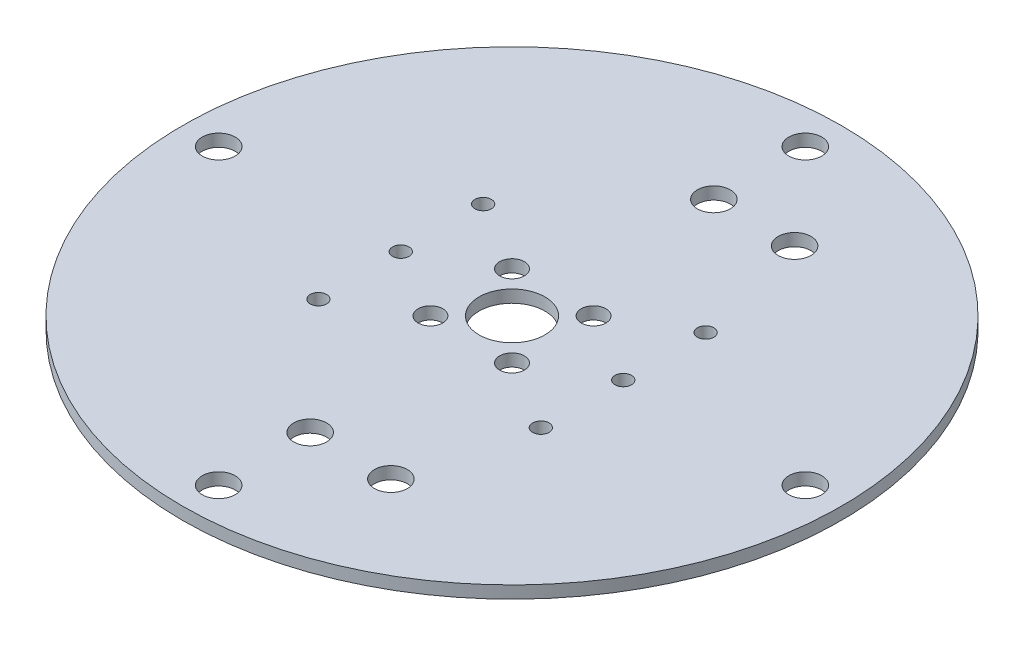
ISO-10303-21;
HEADER;
FILE_DESCRIPTION(('STEP AP214'),'2;1');
FILE_NAME('part.step','',(''),(''),'','','');
FILE_SCHEMA(('AUTOMOTIVE_DESIGN { 1 0 10303 214 1 1 1 1 }'));
ENDSEC;
DATA;
#1=APPLICATION_CONTEXT('core data for automotive mechanical design processes');
#2=APPLICATION_PROTOCOL_DEFINITION('international standard','automotive_design',2000,#1);
#3=PRODUCT_CONTEXT('',#1,'mechanical');
#4=PRODUCT('Part','Part','',(#3));
#5=PRODUCT_RELATED_PRODUCT_CATEGORY('part','',(#4));
#6=PRODUCT_DEFINITION_FORMATION('','',#4);
#7=PRODUCT_DEFINITION_CONTEXT('part definition',#1,'design');
#8=PRODUCT_DEFINITION('design','',#6,#7);
#9=PRODUCT_DEFINITION_SHAPE('','',#8);
#10=(LENGTH_UNIT() NAMED_UNIT(*) SI_UNIT(.MILLI.,.METRE.));
#11=(NAMED_UNIT(*) PLANE_ANGLE_UNIT() SI_UNIT($,.RADIAN.));
#12=(NAMED_UNIT(*) SI_UNIT($,.STERADIAN.) SOLID_ANGLE_UNIT());
#13=UNCERTAINTY_MEASURE_WITH_UNIT(LENGTH_MEASURE(1.E-05),#10,'distance_accuracy_value','');
#14=(GEOMETRIC_REPRESENTATION_CONTEXT(3) GLOBAL_UNCERTAINTY_ASSIGNED_CONTEXT((#13)) GLOBAL_UNIT_ASSIGNED_CONTEXT((#10,
#11,#12)) REPRESENTATION_CONTEXT('',''));
#15=CARTESIAN_POINT('',(0.,0.,0.));
#16=DIRECTION('',(0.,0.,1.));
#17=DIRECTION('',(1.,0.,0.));
#18=AXIS2_PLACEMENT_3D('',#15,#16,#17);
#19=CARTESIAN_POINT('',(0.,1.5,0.));
#20=DIRECTION('',(0.,1.,0.));
#21=DIRECTION('',(0.,0.,1.));
#22=AXIS2_PLACEMENT_3D('',#19,#20,#21);
#23=PLANE('',#22);
#24=CARTESIAN_POINT('',(13.5,1.5,0.));
#25=DIRECTION('',(0.,1.,0.));
#26=DIRECTION('',(0.,0.,-1.));
#27=AXIS2_PLACEMENT_3D('',#24,#25,#26);
#28=CIRCLE('',#27,1.);
#29=CARTESIAN_POINT('',(13.5,1.5,-0.999999999999998));
#30=VERTEX_POINT('',#29);
#31=EDGE_CURVE('E194',#30,#30,#28,.T.);
#32=ORIENTED_EDGE('',*,*,#31,.F.);
#33=EDGE_LOOP('',(#32));
#34=FACE_BOUND('',#33,.T.);
#35=CARTESIAN_POINT('',(-13.5,1.5,10.));
#36=DIRECTION('',(0.,1.,0.));
#37=DIRECTION('',(0.,0.,1.));
#38=AXIS2_PLACEMENT_3D('',#35,#36,#37);
#39=CIRCLE('',#38,1.);
#40=CARTESIAN_POINT('',(-13.5,1.5,11.));
#41=VERTEX_POINT('',#40);
#42=EDGE_CURVE('E178',#41,#41,#39,.T.);
#43=ORIENTED_EDGE('',*,*,#42,.F.);
#44=EDGE_LOOP('',(#43));
#45=FACE_BOUND('',#44,.T.);
#46=CARTESIAN_POINT('',(-13.5,1.5,0.));
#47=DIRECTION('',(0.,1.,0.));
#48=DIRECTION('',(0.,0.,1.));
#49=AXIS2_PLACEMENT_3D('',#46,#47,#48);
#50=CIRCLE('',#49,1.);
#51=CARTESIAN_POINT('',(-13.5,1.5,1.));
#52=VERTEX_POINT('',#51);
#53=EDGE_CURVE('E162',#52,#52,#50,.T.);
#54=ORIENTED_EDGE('',*,*,#53,.F.);
#55=EDGE_LOOP('',(#54));
#56=FACE_BOUND('',#55,.T.);
#57=CARTESIAN_POINT('',(0.,1.5,24.5));
#58=DIRECTION('',(0.,1.,0.));
#59=DIRECTION('',(0.,0.,1.));
#60=AXIS2_PLACEMENT_3D('',#57,#58,#59);
#61=CIRCLE('',#60,2.);
#62=CARTESIAN_POINT('',(0.,1.5,26.5));
#63=VERTEX_POINT('',#62);
#64=EDGE_CURVE('E146',#63,#63,#61,.T.);
#65=ORIENTED_EDGE('',*,*,#64,.F.);
#66=EDGE_LOOP('',(#65));
#67=FACE_BOUND('',#66,.T.);
#68=CARTESIAN_POINT('',(0.,1.5,-24.5));
#69=DIRECTION('',(0.,1.,0.));
#70=DIRECTION('',(0.,0.,1.));
#71=AXIS2_PLACEMENT_3D('',#68,#69,#70);
#72=CIRCLE('',#71,2.);
#73=CARTESIAN_POINT('',(0.,1.5,-22.5));
#74=VERTEX_POINT('',#73);
#75=EDGE_CURVE('E130',#74,#74,#72,.T.);
#76=ORIENTED_EDGE('',*,*,#75,.F.);
#77=EDGE_LOOP('',(#76));
#78=FACE_BOUND('',#77,.T.);
#79=CARTESIAN_POINT('',(4.94974746830589,1.5,4.94974746830577));
#80=DIRECTION('',(0.,1.,0.));
#81=DIRECTION('',(0.,0.,1.));
#82=AXIS2_PLACEMENT_3D('',#79,#80,#81);
#83=CIRCLE('',#82,1.5);
#84=CARTESIAN_POINT('',(4.94974746830589,1.5,6.44974746830577));
#85=VERTEX_POINT('',#84);
#86=EDGE_CURVE('E114',#85,#85,#83,.T.);
#87=ORIENTED_EDGE('',*,*,#86,.F.);
#88=EDGE_LOOP('',(#87));
#89=FACE_BOUND('',#88,.T.);
#90=CARTESIAN_POINT('',(-4.94974746830586,1.5,-4.94974746830581));
#91=DIRECTION('',(0.,1.,0.));
#92=DIRECTION('',(0.,0.,1.));
#93=AXIS2_PLACEMENT_3D('',#90,#91,#92);
#94=CIRCLE('',#93,1.5);
#95=CARTESIAN_POINT('',(-4.94974746830586,1.5,-3.44974746830581));
#96=VERTEX_POINT('',#95);
#97=EDGE_CURVE('E98',#96,#96,#94,.T.);
#98=ORIENTED_EDGE('',*,*,#97,.F.);
#99=EDGE_LOOP('',(#98));
#100=FACE_BOUND('',#99,.T.);
#101=CARTESIAN_POINT('',(35.6,1.5,0.));
#102=DIRECTION('',(0.,1.,0.));
#103=DIRECTION('',(0.,0.,1.));
#104=AXIS2_PLACEMENT_3D('',#101,#102,#103);
#105=CIRCLE('',#104,2.);
#106=CARTESIAN_POINT('',(35.6,1.5,2.));
#107=VERTEX_POINT('',#106);
#108=EDGE_CURVE('E82',#107,#107,#105,.T.);
#109=ORIENTED_EDGE('',*,*,#108,.F.);
#110=EDGE_LOOP('',(#109));
#111=FACE_BOUND('',#110,.T.);
#112=CARTESIAN_POINT('',(-35.6,1.5,0.));
#113=DIRECTION('',(0.,1.,0.));
#114=DIRECTION('',(0.,0.,1.));
#115=AXIS2_PLACEMENT_3D('',#112,#113,#114);
#116=CIRCLE('',#115,2.);
#117=CARTESIAN_POINT('',(-35.6,1.5,2.));
#118=VERTEX_POINT('',#117);
#119=EDGE_CURVE('E66',#118,#118,#116,.T.);
#120=ORIENTED_EDGE('',*,*,#119,.F.);
#121=EDGE_LOOP('',(#120));
#122=FACE_BOUND('',#121,.T.);
#123=CARTESIAN_POINT('',(0.,1.5,0.));
#124=DIRECTION('',(0.,1.,0.));
#125=DIRECTION('',(0.,0.,1.));
#126=AXIS2_PLACEMENT_3D('',#123,#124,#125);
#127=CIRCLE('',#126,40.);
#128=CARTESIAN_POINT('',(0.,1.5,40.));
#129=VERTEX_POINT('',#128);
#130=EDGE_CURVE('E10',#129,#129,#127,.T.);
#131=ORIENTED_EDGE('',*,*,#130,.T.);
#132=EDGE_LOOP('',(#131));
#133=FACE_BOUND('',#132,.T.);
#134=CARTESIAN_POINT('',(0.,1.5,-35.6));
#135=DIRECTION('',(0.,1.,0.));
#136=DIRECTION('',(0.,0.,1.));
#137=AXIS2_PLACEMENT_3D('',#134,#135,#136);
#138=CIRCLE('',#137,2.);
#139=CARTESIAN_POINT('',(0.,1.5,-33.6));
#140=VERTEX_POINT('',#139);
#141=EDGE_CURVE('E60',#140,#140,#138,.T.);
#142=ORIENTED_EDGE('',*,*,#141,.F.);
#143=EDGE_LOOP('',(#142));
#144=FACE_BOUND('',#143,.T.);
#145=CARTESIAN_POINT('',(0.,1.5,35.6));
#146=DIRECTION('',(0.,1.,0.));
#147=DIRECTION('',(0.,0.,1.));
#148=AXIS2_PLACEMENT_3D('',#145,#146,#147);
#149=CIRCLE('',#148,2.);
#150=CARTESIAN_POINT('',(0.,1.5,37.6));
#151=VERTEX_POINT('',#150);
#152=EDGE_CURVE('E74',#151,#151,#149,.T.);
#153=ORIENTED_EDGE('',*,*,#152,.F.);
#154=EDGE_LOOP('',(#153));
#155=FACE_BOUND('',#154,.T.);
#156=CARTESIAN_POINT('',(0.,1.5,0.));
#157=DIRECTION('',(0.,1.,0.));
#158=DIRECTION('',(0.,0.,1.));
#159=AXIS2_PLACEMENT_3D('',#156,#157,#158);
#160=CIRCLE('',#159,4.);
#161=CARTESIAN_POINT('',(0.,1.5,4.));
#162=VERTEX_POINT('',#161);
#163=EDGE_CURVE('E90',#162,#162,#160,.T.);
#164=ORIENTED_EDGE('',*,*,#163,.F.);
#165=EDGE_LOOP('',(#164));
#166=FACE_BOUND('',#165,.T.);
#167=CARTESIAN_POINT('',(4.94974746830582,1.5,-4.94974746830584));
#168=DIRECTION('',(0.,1.,0.));
#169=DIRECTION('',(0.,0.,1.));
#170=AXIS2_PLACEMENT_3D('',#167,#168,#169);
#171=CIRCLE('',#170,1.5);
#172=CARTESIAN_POINT('',(4.94974746830582,1.5,-3.44974746830584));
#173=VERTEX_POINT('',#172);
#174=EDGE_CURVE('E106',#173,#173,#171,.T.);
#175=ORIENTED_EDGE('',*,*,#174,.F.);
#176=EDGE_LOOP('',(#175));
#177=FACE_BOUND('',#176,.T.);
#178=CARTESIAN_POINT('',(-4.94974746830579,1.5,4.94974746830588));
#179=DIRECTION('',(0.,1.,0.));
#180=DIRECTION('',(0.,0.,1.));
#181=AXIS2_PLACEMENT_3D('',#178,#179,#180);
#182=CIRCLE('',#181,1.5);
#183=CARTESIAN_POINT('',(-4.94974746830579,1.5,6.44974746830588));
#184=VERTEX_POINT('',#183);
#185=EDGE_CURVE('E122',#184,#184,#182,.T.);
#186=ORIENTED_EDGE('',*,*,#185,.F.);
#187=EDGE_LOOP('',(#186));
#188=FACE_BOUND('',#187,.T.);
#189=CARTESIAN_POINT('',(9.8,1.5,-24.5));
#190=DIRECTION('',(0.,1.,0.));
#191=DIRECTION('',(0.,0.,1.));
#192=AXIS2_PLACEMENT_3D('',#189,#190,#191);
#193=CIRCLE('',#192,2.);
#194=CARTESIAN_POINT('',(9.8,1.5,-22.5));
#195=VERTEX_POINT('',#194);
#196=EDGE_CURVE('E138',#195,#195,#193,.T.);
#197=ORIENTED_EDGE('',*,*,#196,.F.);
#198=EDGE_LOOP('',(#197));
#199=FACE_BOUND('',#198,.T.);
#200=CARTESIAN_POINT('',(9.8,1.5,24.5));
#201=DIRECTION('',(0.,1.,0.));
#202=DIRECTION('',(0.,0.,-1.));
#203=AXIS2_PLACEMENT_3D('',#200,#201,#202);
#204=CIRCLE('',#203,2.);
#205=CARTESIAN_POINT('',(9.8,1.5,22.5));
#206=VERTEX_POINT('',#205);
#207=EDGE_CURVE('E154',#206,#206,#204,.T.);
#208=ORIENTED_EDGE('',*,*,#207,.F.);
#209=EDGE_LOOP('',(#208));
#210=FACE_BOUND('',#209,.T.);
#211=CARTESIAN_POINT('',(-13.5,1.5,-10.));
#212=DIRECTION('',(0.,1.,0.));
#213=DIRECTION('',(0.,0.,1.));
#214=AXIS2_PLACEMENT_3D('',#211,#212,#213);
#215=CIRCLE('',#214,0.999999999999999);
#216=CARTESIAN_POINT('',(-13.5,1.5,-9.));
#217=VERTEX_POINT('',#216);
#218=EDGE_CURVE('E170',#217,#217,#215,.T.);
#219=ORIENTED_EDGE('',*,*,#218,.F.);
#220=EDGE_LOOP('',(#219));
#221=FACE_BOUND('',#220,.T.);
#222=CARTESIAN_POINT('',(13.5,1.5,-10.));
#223=DIRECTION('',(0.,1.,0.));
#224=DIRECTION('',(0.,0.,-1.));
#225=AXIS2_PLACEMENT_3D('',#222,#223,#224);
#226=CIRCLE('',#225,0.999999999999999);
#227=CARTESIAN_POINT('',(13.5,1.5,-11.));
#228=VERTEX_POINT('',#227);
#229=EDGE_CURVE('E186',#228,#228,#226,.T.);
#230=ORIENTED_EDGE('',*,*,#229,.F.);
#231=EDGE_LOOP('',(#230));
#232=FACE_BOUND('',#231,.T.);
#233=CARTESIAN_POINT('',(13.5,1.5,10.));
#234=DIRECTION('',(0.,1.,0.));
#235=DIRECTION('',(0.,0.,-1.));
#236=AXIS2_PLACEMENT_3D('',#233,#234,#235);
#237=CIRCLE('',#236,1.);
#238=CARTESIAN_POINT('',(13.5,1.5,9.));
#239=VERTEX_POINT('',#238);
#240=EDGE_CURVE('E202',#239,#239,#237,.T.);
#241=ORIENTED_EDGE('',*,*,#240,.F.);
#242=EDGE_LOOP('',(#241));
#243=FACE_BOUND('',#242,.T.);
#244=ADVANCED_FACE('F47',(#34,#45,#56,#67,#78,#89,#100,#111,#122,#133,#144,#155,#166,#177,#188,
#199,#210,#221,#232,#243),#23,.T.);
#245=CARTESIAN_POINT('',(0.,0.,0.));
#246=DIRECTION('',(0.,1.,0.));
#247=DIRECTION('',(0.,0.,1.));
#248=AXIS2_PLACEMENT_3D('',#245,#246,#247);
#249=PLANE('',#248);
#250=CARTESIAN_POINT('',(0.,0.,0.));
#251=DIRECTION('',(0.,1.,0.));
#252=DIRECTION('',(0.,0.,1.));
#253=AXIS2_PLACEMENT_3D('',#250,#251,#252);
#254=CIRCLE('',#253,40.);
#255=CARTESIAN_POINT('',(0.,0.,40.));
#256=VERTEX_POINT('',#255);
#257=EDGE_CURVE('E51',#256,#256,#254,.T.);
#258=ORIENTED_EDGE('',*,*,#257,.F.);
#259=EDGE_LOOP('',(#258));
#260=FACE_BOUND('',#259,.T.);
#261=CARTESIAN_POINT('',(0.,0.,-35.6));
#262=DIRECTION('',(0.,1.,0.));
#263=DIRECTION('',(0.,0.,1.));
#264=AXIS2_PLACEMENT_3D('',#261,#262,#263);
#265=CIRCLE('',#264,2.);
#266=CARTESIAN_POINT('',(0.,0.,-33.6));
#267=VERTEX_POINT('',#266);
#268=EDGE_CURVE('E62',#267,#267,#265,.T.);
#269=ORIENTED_EDGE('',*,*,#268,.T.);
#270=EDGE_LOOP('',(#269));
#271=FACE_BOUND('',#270,.T.);
#272=CARTESIAN_POINT('',(-35.6,0.,0.));
#273=DIRECTION('',(0.,1.,0.));
#274=DIRECTION('',(0.,0.,1.));
#275=AXIS2_PLACEMENT_3D('',#272,#273,#274);
#276=CIRCLE('',#275,2.);
#277=CARTESIAN_POINT('',(-35.6,0.,2.));
#278=VERTEX_POINT('',#277);
#279=EDGE_CURVE('E70',#278,#278,#276,.T.);
#280=ORIENTED_EDGE('',*,*,#279,.T.);
#281=EDGE_LOOP('',(#280));
#282=FACE_BOUND('',#281,.T.);
#283=CARTESIAN_POINT('',(0.,0.,35.6));
#284=DIRECTION('',(0.,1.,0.));
#285=DIRECTION('',(0.,0.,1.));
#286=AXIS2_PLACEMENT_3D('',#283,#284,#285);
#287=CIRCLE('',#286,2.);
#288=CARTESIAN_POINT('',(0.,0.,37.6));
#289=VERTEX_POINT('',#288);
#290=EDGE_CURVE('E78',#289,#289,#287,.T.);
#291=ORIENTED_EDGE('',*,*,#290,.T.);
#292=EDGE_LOOP('',(#291));
#293=FACE_BOUND('',#292,.T.);
#294=CARTESIAN_POINT('',(35.6,0.,0.));
#295=DIRECTION('',(0.,1.,0.));
#296=DIRECTION('',(0.,0.,1.));
#297=AXIS2_PLACEMENT_3D('',#294,#295,#296);
#298=CIRCLE('',#297,2.);
#299=CARTESIAN_POINT('',(35.6,0.,2.));
#300=VERTEX_POINT('',#299);
#301=EDGE_CURVE('E86',#300,#300,#298,.T.);
#302=ORIENTED_EDGE('',*,*,#301,.T.);
#303=EDGE_LOOP('',(#302));
#304=FACE_BOUND('',#303,.T.);
#305=CARTESIAN_POINT('',(0.,0.,0.));
#306=DIRECTION('',(0.,1.,0.));
#307=DIRECTION('',(0.,0.,1.));
#308=AXIS2_PLACEMENT_3D('',#305,#306,#307);
#309=CIRCLE('',#308,4.);
#310=CARTESIAN_POINT('',(0.,0.,4.));
#311=VERTEX_POINT('',#310);
#312=EDGE_CURVE('E94',#311,#311,#309,.T.);
#313=ORIENTED_EDGE('',*,*,#312,.T.);
#314=EDGE_LOOP('',(#313));
#315=FACE_BOUND('',#314,.T.);
#316=CARTESIAN_POINT('',(-4.94974746830586,0.,-4.94974746830581));
#317=DIRECTION('',(0.,1.,0.));
#318=DIRECTION('',(0.,0.,1.));
#319=AXIS2_PLACEMENT_3D('',#316,#317,#318);
#320=CIRCLE('',#319,1.5);
#321=CARTESIAN_POINT('',(-4.94974746830586,0.,-3.44974746830581));
#322=VERTEX_POINT('',#321);
#323=EDGE_CURVE('E102',#322,#322,#320,.T.);
#324=ORIENTED_EDGE('',*,*,#323,.T.);
#325=EDGE_LOOP('',(#324));
#326=FACE_BOUND('',#325,.T.);
#327=CARTESIAN_POINT('',(4.94974746830582,0.,-4.94974746830584));
#328=DIRECTION('',(0.,1.,0.));
#329=DIRECTION('',(0.,0.,1.));
#330=AXIS2_PLACEMENT_3D('',#327,#328,#329);
#331=CIRCLE('',#330,1.5);
#332=CARTESIAN_POINT('',(4.94974746830582,0.,-3.44974746830584));
#333=VERTEX_POINT('',#332);
#334=EDGE_CURVE('E110',#333,#333,#331,.T.);
#335=ORIENTED_EDGE('',*,*,#334,.T.);
#336=EDGE_LOOP('',(#335));
#337=FACE_BOUND('',#336,.T.);
#338=CARTESIAN_POINT('',(4.94974746830589,0.,4.94974746830577));
#339=DIRECTION('',(0.,1.,0.));
#340=DIRECTION('',(0.,0.,1.));
#341=AXIS2_PLACEMENT_3D('',#338,#339,#340);
#342=CIRCLE('',#341,1.5);
#343=CARTESIAN_POINT('',(4.94974746830589,0.,6.44974746830577));
#344=VERTEX_POINT('',#343);
#345=EDGE_CURVE('E118',#344,#344,#342,.T.);
#346=ORIENTED_EDGE('',*,*,#345,.T.);
#347=EDGE_LOOP('',(#346));
#348=FACE_BOUND('',#347,.T.);
#349=CARTESIAN_POINT('',(-4.94974746830579,0.,4.94974746830588));
#350=DIRECTION('',(0.,1.,0.));
#351=DIRECTION('',(0.,0.,1.));
#352=AXIS2_PLACEMENT_3D('',#349,#350,#351);
#353=CIRCLE('',#352,1.5);
#354=CARTESIAN_POINT('',(-4.94974746830579,0.,6.44974746830588));
#355=VERTEX_POINT('',#354);
#356=EDGE_CURVE('E126',#355,#355,#353,.T.);
#357=ORIENTED_EDGE('',*,*,#356,.T.);
#358=EDGE_LOOP('',(#357));
#359=FACE_BOUND('',#358,.T.);
#360=CARTESIAN_POINT('',(0.,0.,-24.5));
#361=DIRECTION('',(0.,1.,0.));
#362=DIRECTION('',(0.,0.,1.));
#363=AXIS2_PLACEMENT_3D('',#360,#361,#362);
#364=CIRCLE('',#363,2.);
#365=CARTESIAN_POINT('',(0.,0.,-22.5));
#366=VERTEX_POINT('',#365);
#367=EDGE_CURVE('E134',#366,#366,#364,.T.);
#368=ORIENTED_EDGE('',*,*,#367,.T.);
#369=EDGE_LOOP('',(#368));
#370=FACE_BOUND('',#369,.T.);
#371=CARTESIAN_POINT('',(9.8,0.,-24.5));
#372=DIRECTION('',(0.,1.,0.));
#373=DIRECTION('',(0.,0.,1.));
#374=AXIS2_PLACEMENT_3D('',#371,#372,#373);
#375=CIRCLE('',#374,2.);
#376=CARTESIAN_POINT('',(9.8,0.,-22.5));
#377=VERTEX_POINT('',#376);
#378=EDGE_CURVE('E142',#377,#377,#375,.T.);
#379=ORIENTED_EDGE('',*,*,#378,.T.);
#380=EDGE_LOOP('',(#379));
#381=FACE_BOUND('',#380,.T.);
#382=CARTESIAN_POINT('',(0.,0.,24.5));
#383=DIRECTION('',(0.,1.,0.));
#384=DIRECTION('',(0.,0.,1.));
#385=AXIS2_PLACEMENT_3D('',#382,#383,#384);
#386=CIRCLE('',#385,2.);
#387=CARTESIAN_POINT('',(0.,0.,26.5));
#388=VERTEX_POINT('',#387);
#389=EDGE_CURVE('E150',#388,#388,#386,.T.);
#390=ORIENTED_EDGE('',*,*,#389,.T.);
#391=EDGE_LOOP('',(#390));
#392=FACE_BOUND('',#391,.T.);
#393=CARTESIAN_POINT('',(9.8,0.,24.5));
#394=DIRECTION('',(0.,1.,0.));
#395=DIRECTION('',(0.,0.,-1.));
#396=AXIS2_PLACEMENT_3D('',#393,#394,#395);
#397=CIRCLE('',#396,2.);
#398=CARTESIAN_POINT('',(9.8,0.,22.5));
#399=VERTEX_POINT('',#398);
#400=EDGE_CURVE('E158',#399,#399,#397,.T.);
#401=ORIENTED_EDGE('',*,*,#400,.T.);
#402=EDGE_LOOP('',(#401));
#403=FACE_BOUND('',#402,.T.);
#404=CARTESIAN_POINT('',(-13.5,0.,0.));
#405=DIRECTION('',(0.,1.,0.));
#406=DIRECTION('',(0.,0.,1.));
#407=AXIS2_PLACEMENT_3D('',#404,#405,#406);
#408=CIRCLE('',#407,1.);
#409=CARTESIAN_POINT('',(-13.5,0.,1.));
#410=VERTEX_POINT('',#409);
#411=EDGE_CURVE('E166',#410,#410,#408,.T.);
#412=ORIENTED_EDGE('',*,*,#411,.T.);
#413=EDGE_LOOP('',(#412));
#414=FACE_BOUND('',#413,.T.);
#415=CARTESIAN_POINT('',(-13.5,0.,-10.));
#416=DIRECTION('',(0.,1.,0.));
#417=DIRECTION('',(0.,0.,1.));
#418=AXIS2_PLACEMENT_3D('',#415,#416,#417);
#419=CIRCLE('',#418,0.999999999999999);
#420=CARTESIAN_POINT('',(-13.5,0.,-9.));
#421=VERTEX_POINT('',#420);
#422=EDGE_CURVE('E174',#421,#421,#419,.T.);
#423=ORIENTED_EDGE('',*,*,#422,.T.);
#424=EDGE_LOOP('',(#423));
#425=FACE_BOUND('',#424,.T.);
#426=CARTESIAN_POINT('',(-13.5,0.,10.));
#427=DIRECTION('',(0.,1.,0.));
#428=DIRECTION('',(0.,0.,1.));
#429=AXIS2_PLACEMENT_3D('',#426,#427,#428);
#430=CIRCLE('',#429,1.);
#431=CARTESIAN_POINT('',(-13.5,0.,11.));
#432=VERTEX_POINT('',#431);
#433=EDGE_CURVE('E182',#432,#432,#430,.T.);
#434=ORIENTED_EDGE('',*,*,#433,.T.);
#435=EDGE_LOOP('',(#434));
#436=FACE_BOUND('',#435,.T.);
#437=CARTESIAN_POINT('',(13.5,0.,-10.));
#438=DIRECTION('',(0.,1.,0.));
#439=DIRECTION('',(0.,0.,-1.));
#440=AXIS2_PLACEMENT_3D('',#437,#438,#439);
#441=CIRCLE('',#440,0.999999999999999);
#442=CARTESIAN_POINT('',(13.5,0.,-11.));
#443=VERTEX_POINT('',#442);
#444=EDGE_CURVE('E190',#443,#443,#441,.T.);
#445=ORIENTED_EDGE('',*,*,#444,.T.);
#446=EDGE_LOOP('',(#445));
#447=FACE_BOUND('',#446,.T.);
#448=CARTESIAN_POINT('',(13.5,0.,0.));
#449=DIRECTION('',(0.,1.,0.));
#450=DIRECTION('',(0.,0.,-1.));
#451=AXIS2_PLACEMENT_3D('',#448,#449,#450);
#452=CIRCLE('',#451,1.);
#453=CARTESIAN_POINT('',(13.5,0.,-0.999999999999998));
#454=VERTEX_POINT('',#453);
#455=EDGE_CURVE('E198',#454,#454,#452,.T.);
#456=ORIENTED_EDGE('',*,*,#455,.T.);
#457=EDGE_LOOP('',(#456));
#458=FACE_BOUND('',#457,.T.);
#459=CARTESIAN_POINT('',(13.5,0.,10.));
#460=DIRECTION('',(0.,1.,0.));
#461=DIRECTION('',(0.,0.,-1.));
#462=AXIS2_PLACEMENT_3D('',#459,#460,#461);
#463=CIRCLE('',#462,1.);
#464=CARTESIAN_POINT('',(13.5,0.,9.));
#465=VERTEX_POINT('',#464);
#466=EDGE_CURVE('E206',#465,#465,#463,.T.);
#467=ORIENTED_EDGE('',*,*,#466,.T.);
#468=EDGE_LOOP('',(#467));
#469=FACE_BOUND('',#468,.T.);
#470=ADVANCED_FACE('F218',(#260,#271,#282,#293,#304,#315,#326,#337,#348,#359,#370,#381,#392,
#403,#414,#425,#436,#447,#458,#469),#249,.F.);
#471=CARTESIAN_POINT('',(0.,1.5,0.));
#472=DIRECTION('',(0.,-1.,0.));
#473=DIRECTION('',(0.,0.,-1.));
#474=AXIS2_PLACEMENT_3D('',#471,#472,#473);
#475=CYLINDRICAL_SURFACE('',#474,40.);
#476=ORIENTED_EDGE('',*,*,#130,.F.);
#477=EDGE_LOOP('',(#476));
#478=FACE_BOUND('',#477,.T.);
#479=ORIENTED_EDGE('',*,*,#257,.T.);
#480=EDGE_LOOP('',(#479));
#481=FACE_BOUND('',#480,.T.);
#482=ADVANCED_FACE('F49',(#478,#481),#475,.T.);
#483=CARTESIAN_POINT('',(0.,1.5,-35.6));
#484=DIRECTION('',(0.,-1.,0.));
#485=DIRECTION('',(0.,0.,-1.));
#486=AXIS2_PLACEMENT_3D('',#483,#484,#485);
#487=CYLINDRICAL_SURFACE('',#486,2.);
#488=ORIENTED_EDGE('',*,*,#141,.T.);
#489=EDGE_LOOP('',(#488));
#490=FACE_BOUND('',#489,.T.);
#491=ORIENTED_EDGE('',*,*,#268,.F.);
#492=EDGE_LOOP('',(#491));
#493=FACE_BOUND('',#492,.T.);
#494=ADVANCED_FACE('F228',(#490,#493),#487,.F.);
#495=CARTESIAN_POINT('',(-35.6,1.5,0.));
#496=DIRECTION('',(0.,-1.,0.));
#497=DIRECTION('',(0.,0.,-1.));
#498=AXIS2_PLACEMENT_3D('',#495,#496,#497);
#499=CYLINDRICAL_SURFACE('',#498,2.);
#500=ORIENTED_EDGE('',*,*,#119,.T.);
#501=EDGE_LOOP('',(#500));
#502=FACE_BOUND('',#501,.T.);
#503=ORIENTED_EDGE('',*,*,#279,.F.);
#504=EDGE_LOOP('',(#503));
#505=FACE_BOUND('',#504,.T.);
#506=ADVANCED_FACE('F231',(#502,#505),#499,.F.);
#507=CARTESIAN_POINT('',(0.,1.5,35.6));
#508=DIRECTION('',(0.,-1.,0.));
#509=DIRECTION('',(0.,0.,-1.));
#510=AXIS2_PLACEMENT_3D('',#507,#508,#509);
#511=CYLINDRICAL_SURFACE('',#510,2.);
#512=ORIENTED_EDGE('',*,*,#152,.T.);
#513=EDGE_LOOP('',(#512));
#514=FACE_BOUND('',#513,.T.);
#515=ORIENTED_EDGE('',*,*,#290,.F.);
#516=EDGE_LOOP('',(#515));
#517=FACE_BOUND('',#516,.T.);
#518=ADVANCED_FACE('F235',(#514,#517),#511,.F.);
#519=CARTESIAN_POINT('',(35.6,1.5,0.));
#520=DIRECTION('',(0.,-1.,0.));
#521=DIRECTION('',(0.,0.,-1.));
#522=AXIS2_PLACEMENT_3D('',#519,#520,#521);
#523=CYLINDRICAL_SURFACE('',#522,2.);
#524=ORIENTED_EDGE('',*,*,#108,.T.);
#525=EDGE_LOOP('',(#524));
#526=FACE_BOUND('',#525,.T.);
#527=ORIENTED_EDGE('',*,*,#301,.F.);
#528=EDGE_LOOP('',(#527));
#529=FACE_BOUND('',#528,.T.);
#530=ADVANCED_FACE('F239',(#526,#529),#523,.F.);
#531=CARTESIAN_POINT('',(0.,1.5,0.));
#532=DIRECTION('',(0.,-1.,0.));
#533=DIRECTION('',(0.,0.,-1.));
#534=AXIS2_PLACEMENT_3D('',#531,#532,#533);
#535=CYLINDRICAL_SURFACE('',#534,4.);
#536=ORIENTED_EDGE('',*,*,#163,.T.);
#537=EDGE_LOOP('',(#536));
#538=FACE_BOUND('',#537,.T.);
#539=ORIENTED_EDGE('',*,*,#312,.F.);
#540=EDGE_LOOP('',(#539));
#541=FACE_BOUND('',#540,.T.);
#542=ADVANCED_FACE('F243',(#538,#541),#535,.F.);
#543=CARTESIAN_POINT('',(-4.94974746830586,1.5,-4.94974746830581));
#544=DIRECTION('',(0.,-1.,0.));
#545=DIRECTION('',(0.,0.,-1.));
#546=AXIS2_PLACEMENT_3D('',#543,#544,#545);
#547=CYLINDRICAL_SURFACE('',#546,1.5);
#548=ORIENTED_EDGE('',*,*,#97,.T.);
#549=EDGE_LOOP('',(#548));
#550=FACE_BOUND('',#549,.T.);
#551=ORIENTED_EDGE('',*,*,#323,.F.);
#552=EDGE_LOOP('',(#551));
#553=FACE_BOUND('',#552,.T.);
#554=ADVANCED_FACE('F247',(#550,#553),#547,.F.);
#555=CARTESIAN_POINT('',(4.94974746830582,1.5,-4.94974746830584));
#556=DIRECTION('',(0.,-1.,0.));
#557=DIRECTION('',(0.,0.,-1.));
#558=AXIS2_PLACEMENT_3D('',#555,#556,#557);
#559=CYLINDRICAL_SURFACE('',#558,1.5);
#560=ORIENTED_EDGE('',*,*,#174,.T.);
#561=EDGE_LOOP('',(#560));
#562=FACE_BOUND('',#561,.T.);
#563=ORIENTED_EDGE('',*,*,#334,.F.);
#564=EDGE_LOOP('',(#563));
#565=FACE_BOUND('',#564,.T.);
#566=ADVANCED_FACE('F251',(#562,#565),#559,.F.);
#567=CARTESIAN_POINT('',(4.94974746830589,1.5,4.94974746830577));
#568=DIRECTION('',(0.,-1.,0.));
#569=DIRECTION('',(0.,0.,-1.));
#570=AXIS2_PLACEMENT_3D('',#567,#568,#569);
#571=CYLINDRICAL_SURFACE('',#570,1.5);
#572=ORIENTED_EDGE('',*,*,#86,.T.);
#573=EDGE_LOOP('',(#572));
#574=FACE_BOUND('',#573,.T.);
#575=ORIENTED_EDGE('',*,*,#345,.F.);
#576=EDGE_LOOP('',(#575));
#577=FACE_BOUND('',#576,.T.);
#578=ADVANCED_FACE('F255',(#574,#577),#571,.F.);
#579=CARTESIAN_POINT('',(-4.94974746830579,1.5,4.94974746830588));
#580=DIRECTION('',(0.,-1.,0.));
#581=DIRECTION('',(0.,0.,-1.));
#582=AXIS2_PLACEMENT_3D('',#579,#580,#581);
#583=CYLINDRICAL_SURFACE('',#582,1.5);
#584=ORIENTED_EDGE('',*,*,#185,.T.);
#585=EDGE_LOOP('',(#584));
#586=FACE_BOUND('',#585,.T.);
#587=ORIENTED_EDGE('',*,*,#356,.F.);
#588=EDGE_LOOP('',(#587));
#589=FACE_BOUND('',#588,.T.);
#590=ADVANCED_FACE('F259',(#586,#589),#583,.F.);
#591=CARTESIAN_POINT('',(0.,1.5,-24.5));
#592=DIRECTION('',(0.,-1.,0.));
#593=DIRECTION('',(0.,0.,-1.));
#594=AXIS2_PLACEMENT_3D('',#591,#592,#593);
#595=CYLINDRICAL_SURFACE('',#594,2.);
#596=ORIENTED_EDGE('',*,*,#75,.T.);
#597=EDGE_LOOP('',(#596));
#598=FACE_BOUND('',#597,.T.);
#599=ORIENTED_EDGE('',*,*,#367,.F.);
#600=EDGE_LOOP('',(#599));
#601=FACE_BOUND('',#600,.T.);
#602=ADVANCED_FACE('F263',(#598,#601),#595,.F.);
#603=CARTESIAN_POINT('',(9.8,1.5,-24.5));
#604=DIRECTION('',(0.,-1.,0.));
#605=DIRECTION('',(0.,0.,-1.));
#606=AXIS2_PLACEMENT_3D('',#603,#604,#605);
#607=CYLINDRICAL_SURFACE('',#606,2.);
#608=ORIENTED_EDGE('',*,*,#196,.T.);
#609=EDGE_LOOP('',(#608));
#610=FACE_BOUND('',#609,.T.);
#611=ORIENTED_EDGE('',*,*,#378,.F.);
#612=EDGE_LOOP('',(#611));
#613=FACE_BOUND('',#612,.T.);
#614=ADVANCED_FACE('F267',(#610,#613),#607,.F.);
#615=CARTESIAN_POINT('',(0.,1.5,24.5));
#616=DIRECTION('',(0.,-1.,0.));
#617=DIRECTION('',(0.,0.,-1.));
#618=AXIS2_PLACEMENT_3D('',#615,#616,#617);
#619=CYLINDRICAL_SURFACE('',#618,2.);
#620=ORIENTED_EDGE('',*,*,#64,.T.);
#621=EDGE_LOOP('',(#620));
#622=FACE_BOUND('',#621,.T.);
#623=ORIENTED_EDGE('',*,*,#389,.F.);
#624=EDGE_LOOP('',(#623));
#625=FACE_BOUND('',#624,.T.);
#626=ADVANCED_FACE('F271',(#622,#625),#619,.F.);
#627=CARTESIAN_POINT('',(9.8,1.5,24.5));
#628=DIRECTION('',(0.,-1.,0.));
#629=DIRECTION('',(0.,0.,-1.));
#630=AXIS2_PLACEMENT_3D('',#627,#628,#629);
#631=CYLINDRICAL_SURFACE('',#630,2.);
#632=ORIENTED_EDGE('',*,*,#207,.T.);
#633=EDGE_LOOP('',(#632));
#634=FACE_BOUND('',#633,.T.);
#635=ORIENTED_EDGE('',*,*,#400,.F.);
#636=EDGE_LOOP('',(#635));
#637=FACE_BOUND('',#636,.T.);
#638=ADVANCED_FACE('F275',(#634,#637),#631,.F.);
#639=CARTESIAN_POINT('',(-13.5,1.5,0.));
#640=DIRECTION('',(0.,-1.,0.));
#641=DIRECTION('',(0.,0.,-1.));
#642=AXIS2_PLACEMENT_3D('',#639,#640,#641);
#643=CYLINDRICAL_SURFACE('',#642,1.);
#644=ORIENTED_EDGE('',*,*,#53,.T.);
#645=EDGE_LOOP('',(#644));
#646=FACE_BOUND('',#645,.T.);
#647=ORIENTED_EDGE('',*,*,#411,.F.);
#648=EDGE_LOOP('',(#647));
#649=FACE_BOUND('',#648,.T.);
#650=ADVANCED_FACE('F279',(#646,#649),#643,.F.);
#651=CARTESIAN_POINT('',(-13.5,1.5,-10.));
#652=DIRECTION('',(0.,-1.,0.));
#653=DIRECTION('',(0.,0.,-1.));
#654=AXIS2_PLACEMENT_3D('',#651,#652,#653);
#655=CYLINDRICAL_SURFACE('',#654,0.999999999999999);
#656=ORIENTED_EDGE('',*,*,#218,.T.);
#657=EDGE_LOOP('',(#656));
#658=FACE_BOUND('',#657,.T.);
#659=ORIENTED_EDGE('',*,*,#422,.F.);
#660=EDGE_LOOP('',(#659));
#661=FACE_BOUND('',#660,.T.);
#662=ADVANCED_FACE('F283',(#658,#661),#655,.F.);
#663=CARTESIAN_POINT('',(-13.5,1.5,10.));
#664=DIRECTION('',(0.,-1.,0.));
#665=DIRECTION('',(0.,0.,-1.));
#666=AXIS2_PLACEMENT_3D('',#663,#664,#665);
#667=CYLINDRICAL_SURFACE('',#666,1.);
#668=ORIENTED_EDGE('',*,*,#42,.T.);
#669=EDGE_LOOP('',(#668));
#670=FACE_BOUND('',#669,.T.);
#671=ORIENTED_EDGE('',*,*,#433,.F.);
#672=EDGE_LOOP('',(#671));
#673=FACE_BOUND('',#672,.T.);
#674=ADVANCED_FACE('F287',(#670,#673),#667,.F.);
#675=CARTESIAN_POINT('',(13.5,1.5,-10.));
#676=DIRECTION('',(0.,-1.,0.));
#677=DIRECTION('',(0.,0.,-1.));
#678=AXIS2_PLACEMENT_3D('',#675,#676,#677);
#679=CYLINDRICAL_SURFACE('',#678,0.999999999999999);
#680=ORIENTED_EDGE('',*,*,#229,.T.);
#681=EDGE_LOOP('',(#680));
#682=FACE_BOUND('',#681,.T.);
#683=ORIENTED_EDGE('',*,*,#444,.F.);
#684=EDGE_LOOP('',(#683));
#685=FACE_BOUND('',#684,.T.);
#686=ADVANCED_FACE('F291',(#682,#685),#679,.F.);
#687=CARTESIAN_POINT('',(13.5,1.5,0.));
#688=DIRECTION('',(0.,-1.,0.));
#689=DIRECTION('',(0.,0.,-1.));
#690=AXIS2_PLACEMENT_3D('',#687,#688,#689);
#691=CYLINDRICAL_SURFACE('',#690,1.);
#692=ORIENTED_EDGE('',*,*,#31,.T.);
#693=EDGE_LOOP('',(#692));
#694=FACE_BOUND('',#693,.T.);
#695=ORIENTED_EDGE('',*,*,#455,.F.);
#696=EDGE_LOOP('',(#695));
#697=FACE_BOUND('',#696,.T.);
#698=ADVANCED_FACE('F295',(#694,#697),#691,.F.);
#699=CARTESIAN_POINT('',(13.5,1.5,10.));
#700=DIRECTION('',(0.,-1.,0.));
#701=DIRECTION('',(0.,0.,-1.));
#702=AXIS2_PLACEMENT_3D('',#699,#700,#701);
#703=CYLINDRICAL_SURFACE('',#702,1.);
#704=ORIENTED_EDGE('',*,*,#240,.T.);
#705=EDGE_LOOP('',(#704));
#706=FACE_BOUND('',#705,.T.);
#707=ORIENTED_EDGE('',*,*,#466,.F.);
#708=EDGE_LOOP('',(#707));
#709=FACE_BOUND('',#708,.T.);
#710=ADVANCED_FACE('F214',(#706,#709),#703,.F.);
#711=CLOSED_SHELL('',(#244,#470,#482,#494,#506,#518,#530,#542,#554,#566,#578,#590,#602,#614,
#626,#638,#650,#662,#674,#686,#698,#710));
#712=MANIFOLD_SOLID_BREP('B2',#711);
#713=ADVANCED_BREP_SHAPE_REPRESENTATION('',(#18,#712),#14);
#714=SHAPE_DEFINITION_REPRESENTATION(#9,#713);
ENDSEC;
END-ISO-10303-21;
